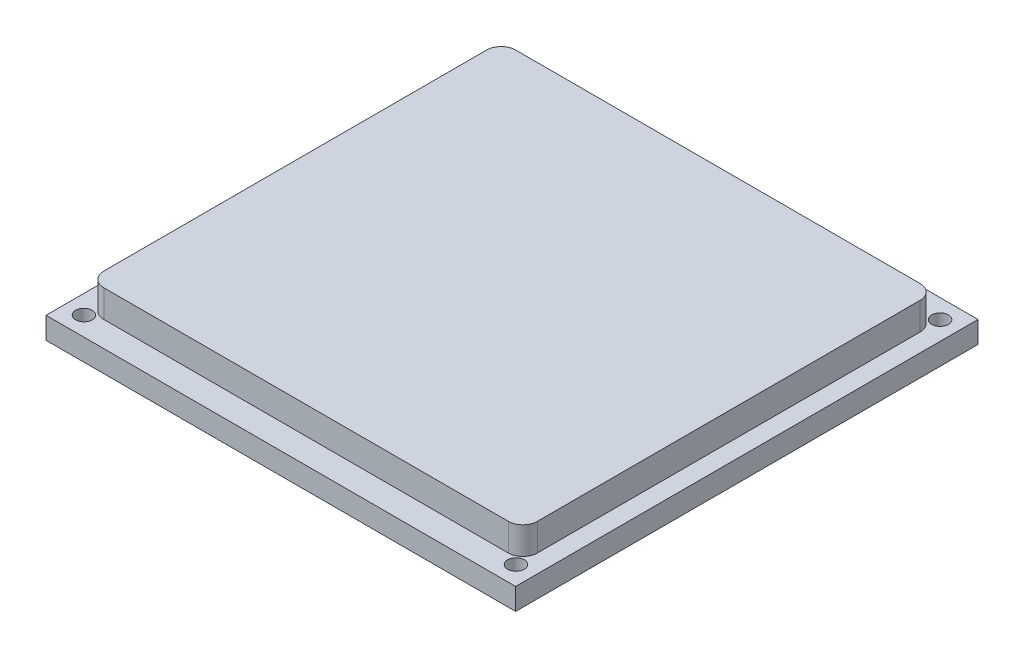
ISO-10303-21;
HEADER;
FILE_DESCRIPTION(('STEP AP214'),'2;1');
FILE_NAME('part.step','',(''),(''),'','','');
FILE_SCHEMA(('AUTOMOTIVE_DESIGN { 1 0 10303 214 1 1 1 1 }'));
ENDSEC;
DATA;
#1=APPLICATION_CONTEXT('core data for automotive mechanical design processes');
#2=APPLICATION_PROTOCOL_DEFINITION('international standard','automotive_design',2000,#1);
#3=PRODUCT_CONTEXT('',#1,'mechanical');
#4=PRODUCT('Part','Part','',(#3));
#5=PRODUCT_RELATED_PRODUCT_CATEGORY('part','',(#4));
#6=PRODUCT_DEFINITION_FORMATION('','',#4);
#7=PRODUCT_DEFINITION_CONTEXT('part definition',#1,'design');
#8=PRODUCT_DEFINITION('design','',#6,#7);
#9=PRODUCT_DEFINITION_SHAPE('','',#8);
#10=(LENGTH_UNIT() NAMED_UNIT(*) SI_UNIT(.MILLI.,.METRE.));
#11=(NAMED_UNIT(*) PLANE_ANGLE_UNIT() SI_UNIT($,.RADIAN.));
#12=(NAMED_UNIT(*) SI_UNIT($,.STERADIAN.) SOLID_ANGLE_UNIT());
#13=UNCERTAINTY_MEASURE_WITH_UNIT(LENGTH_MEASURE(1.E-05),#10,'distance_accuracy_value','');
#14=(GEOMETRIC_REPRESENTATION_CONTEXT(3) GLOBAL_UNCERTAINTY_ASSIGNED_CONTEXT((#13)) GLOBAL_UNIT_ASSIGNED_CONTEXT((#10,
#11,#12)) REPRESENTATION_CONTEXT('',''));
#15=CARTESIAN_POINT('',(0.,0.,0.));
#16=DIRECTION('',(0.,0.,1.));
#17=DIRECTION('',(1.,0.,0.));
#18=AXIS2_PLACEMENT_3D('',#15,#16,#17);
#19=CARTESIAN_POINT('',(0.,3.,0.));
#20=DIRECTION('',(0.,1.,0.));
#21=DIRECTION('',(0.,0.,1.));
#22=AXIS2_PLACEMENT_3D('',#19,#20,#21);
#23=PLANE('',#22);
#24=CARTESIAN_POINT('',(-32.2349514563107,3.,43.6800970873786));
#25=DIRECTION('',(0.,1.,0.));
#26=DIRECTION('',(0.,0.,1.));
#27=AXIS2_PLACEMENT_3D('',#24,#25,#26);
#28=CIRCLE('',#27,1.15);
#29=CARTESIAN_POINT('',(-32.2349514563107,3.,44.8300970873786));
#30=VERTEX_POINT('',#29);
#31=EDGE_CURVE('E167',#30,#30,#28,.T.);
#32=ORIENTED_EDGE('',*,*,#31,.F.);
#33=EDGE_LOOP('',(#32));
#34=FACE_BOUND('',#33,.T.);
#35=CARTESIAN_POINT('',(-32.2349514563107,3.,-15.0199029126214));
#36=DIRECTION('',(0.,1.,0.));
#37=DIRECTION('',(0.,0.,1.));
#38=AXIS2_PLACEMENT_3D('',#35,#36,#37);
#39=CIRCLE('',#38,1.15);
#40=CARTESIAN_POINT('',(-32.2349514563107,3.,-13.8699029126214));
#41=VERTEX_POINT('',#40);
#42=EDGE_CURVE('E179',#41,#41,#39,.T.);
#43=ORIENTED_EDGE('',*,*,#42,.F.);
#44=EDGE_LOOP('',(#43));
#45=FACE_BOUND('',#44,.T.);
#46=DIRECTION('',(0.,0.,1.));
#47=VECTOR('',#46,1.);
#48=CARTESIAN_POINT('',(-34.8349514563107,3.,-17.6699029126214));
#49=LINE('',#48,#47);
#50=CARTESIAN_POINT('',(-34.8349514563107,3.,-17.6699029126214));
#51=VERTEX_POINT('',#50);
#52=CARTESIAN_POINT('',(-34.8349514563107,3.,46.3300970873786));
#53=VERTEX_POINT('',#52);
#54=EDGE_CURVE('E185',#51,#53,#49,.T.);
#55=ORIENTED_EDGE('',*,*,#54,.T.);
#56=DIRECTION('',(1.,0.,0.));
#57=VECTOR('',#56,1.);
#58=CARTESIAN_POINT('',(-34.8349514563107,3.,46.3300970873786));
#59=LINE('',#58,#57);
#60=CARTESIAN_POINT('',(30.1650485436893,3.,46.3300970873786));
#61=VERTEX_POINT('',#60);
#62=EDGE_CURVE('E84',#53,#61,#59,.T.);
#63=ORIENTED_EDGE('',*,*,#62,.T.);
#64=DIRECTION('',(0.,0.,-1.));
#65=VECTOR('',#64,1.);
#66=CARTESIAN_POINT('',(30.1650485436893,3.,-17.6699029126214));
#67=LINE('',#66,#65);
#68=CARTESIAN_POINT('',(30.1650485436893,3.,-17.6699029126214));
#69=VERTEX_POINT('',#68);
#70=EDGE_CURVE('E188',#61,#69,#67,.T.);
#71=ORIENTED_EDGE('',*,*,#70,.T.);
#72=DIRECTION('',(-1.,0.,0.));
#73=VECTOR('',#72,1.);
#74=CARTESIAN_POINT('',(-34.8349514563107,3.,-17.6699029126214));
#75=LINE('',#74,#73);
#76=EDGE_CURVE('E56',#69,#51,#75,.T.);
#77=ORIENTED_EDGE('',*,*,#76,.T.);
#78=EDGE_LOOP('',(#55,#63,#71,#77));
#79=FACE_BOUND('',#78,.T.);
#80=CARTESIAN_POINT('',(27.5650485436893,3.,-15.0199029126214));
#81=DIRECTION('',(0.,1.,0.));
#82=DIRECTION('',(0.,0.,1.));
#83=AXIS2_PLACEMENT_3D('',#80,#81,#82);
#84=CIRCLE('',#83,1.15);
#85=CARTESIAN_POINT('',(27.5650485436893,3.,-13.8699029126214));
#86=VERTEX_POINT('',#85);
#87=EDGE_CURVE('E173',#86,#86,#84,.T.);
#88=ORIENTED_EDGE('',*,*,#87,.F.);
#89=EDGE_LOOP('',(#88));
#90=FACE_BOUND('',#89,.T.);
#91=CARTESIAN_POINT('',(27.5650485436893,3.,43.6800970873786));
#92=DIRECTION('',(0.,1.,0.));
#93=DIRECTION('',(0.,0.,1.));
#94=AXIS2_PLACEMENT_3D('',#91,#92,#93);
#95=CIRCLE('',#94,1.15);
#96=CARTESIAN_POINT('',(27.5650485436893,3.,44.8300970873786));
#97=VERTEX_POINT('',#96);
#98=EDGE_CURVE('E158',#97,#97,#95,.T.);
#99=ORIENTED_EDGE('',*,*,#98,.F.);
#100=EDGE_LOOP('',(#99));
#101=FACE_BOUND('',#100,.T.);
#102=DIRECTION('',(0.,0.,1.));
#103=VECTOR('',#102,1.);
#104=CARTESIAN_POINT('',(-32.3349514563107,3.,-12.1699029126214));
#105=LINE('',#104,#103);
#106=CARTESIAN_POINT('',(-32.3349514563107,3.,-12.1699029126214));
#107=VERTEX_POINT('',#106);
#108=CARTESIAN_POINT('',(-32.3349514563107,3.,40.8300970873786));
#109=VERTEX_POINT('',#108);
#110=EDGE_CURVE('E396',#107,#109,#105,.T.);
#111=ORIENTED_EDGE('',*,*,#110,.F.);
#112=CARTESIAN_POINT('',(-30.3349514563107,3.,-12.1699029126214));
#113=DIRECTION('',(0.,1.,0.));
#114=DIRECTION('',(0.,0.,1.));
#115=AXIS2_PLACEMENT_3D('',#112,#113,#114);
#116=CIRCLE('',#115,2.);
#117=CARTESIAN_POINT('',(-30.3349514563107,3.,-14.1699029126214));
#118=VERTEX_POINT('',#117);
#119=EDGE_CURVE('E153',#118,#107,#116,.T.);
#120=ORIENTED_EDGE('',*,*,#119,.F.);
#121=DIRECTION('',(-1.,0.,0.));
#122=VECTOR('',#121,1.);
#123=CARTESIAN_POINT('',(-30.3349514563107,3.,-14.1699029126214));
#124=LINE('',#123,#122);
#125=CARTESIAN_POINT('',(25.6650485436893,3.,-14.1699029126214));
#126=VERTEX_POINT('',#125);
#127=EDGE_CURVE('E149',#126,#118,#124,.T.);
#128=ORIENTED_EDGE('',*,*,#127,.F.);
#129=CARTESIAN_POINT('',(25.6650485436893,3.,-12.1699029126214));
#130=DIRECTION('',(0.,1.,0.));
#131=DIRECTION('',(0.,0.,1.));
#132=AXIS2_PLACEMENT_3D('',#129,#130,#131);
#133=CIRCLE('',#132,2.00000000000001);
#134=CARTESIAN_POINT('',(27.6650485436893,3.,-12.1699029126214));
#135=VERTEX_POINT('',#134);
#136=EDGE_CURVE('E392',#135,#126,#133,.T.);
#137=ORIENTED_EDGE('',*,*,#136,.F.);
#138=DIRECTION('',(0.,0.,-1.));
#139=VECTOR('',#138,1.);
#140=CARTESIAN_POINT('',(27.6650485436893,3.,-12.1699029126214));
#141=LINE('',#140,#139);
#142=CARTESIAN_POINT('',(27.6650485436893,3.,40.8300970873786));
#143=VERTEX_POINT('',#142);
#144=EDGE_CURVE('E408',#143,#135,#141,.T.);
#145=ORIENTED_EDGE('',*,*,#144,.F.);
#146=CARTESIAN_POINT('',(25.6650485436893,3.,40.8300970873786));
#147=DIRECTION('',(0.,1.,0.));
#148=DIRECTION('',(0.,0.,1.));
#149=AXIS2_PLACEMENT_3D('',#146,#147,#148);
#150=CIRCLE('',#149,2.);
#151=CARTESIAN_POINT('',(25.6650485436893,3.,42.8300970873786));
#152=VERTEX_POINT('',#151);
#153=EDGE_CURVE('E406',#152,#143,#150,.T.);
#154=ORIENTED_EDGE('',*,*,#153,.F.);
#155=DIRECTION('',(1.,0.,0.));
#156=VECTOR('',#155,1.);
#157=CARTESIAN_POINT('',(-30.3349514563107,3.,42.8300970873786));
#158=LINE('',#157,#156);
#159=CARTESIAN_POINT('',(-30.3349514563107,3.,42.8300970873786));
#160=VERTEX_POINT('',#159);
#161=EDGE_CURVE('E404',#160,#152,#158,.T.);
#162=ORIENTED_EDGE('',*,*,#161,.F.);
#163=CARTESIAN_POINT('',(-30.3349514563107,3.,40.8300970873786));
#164=DIRECTION('',(0.,1.,0.));
#165=DIRECTION('',(0.,0.,1.));
#166=AXIS2_PLACEMENT_3D('',#163,#164,#165);
#167=CIRCLE('',#166,2.);
#168=EDGE_CURVE('E398',#109,#160,#167,.T.);
#169=ORIENTED_EDGE('',*,*,#168,.F.);
#170=EDGE_LOOP('',(#111,#120,#128,#137,#145,#154,#162,#169));
#171=FACE_BOUND('',#170,.T.);
#172=ADVANCED_FACE('F32',(#34,#45,#79,#90,#101,#171),#23,.T.);
#173=CARTESIAN_POINT('',(0.,0.,0.));
#174=DIRECTION('',(0.,1.,0.));
#175=DIRECTION('',(0.,0.,1.));
#176=AXIS2_PLACEMENT_3D('',#173,#174,#175);
#177=PLANE('',#176);
#178=DIRECTION('',(0.,0.,1.));
#179=VECTOR('',#178,1.);
#180=CARTESIAN_POINT('',(-34.8349514563107,0.,-17.6699029126214));
#181=LINE('',#180,#179);
#182=CARTESIAN_POINT('',(-34.8349514563107,0.,-17.6699029126214));
#183=VERTEX_POINT('',#182);
#184=CARTESIAN_POINT('',(-34.8349514563107,0.,46.3300970873786));
#185=VERTEX_POINT('',#184);
#186=EDGE_CURVE('E182',#183,#185,#181,.T.);
#187=ORIENTED_EDGE('',*,*,#186,.F.);
#188=DIRECTION('',(-1.,0.,0.));
#189=VECTOR('',#188,1.);
#190=CARTESIAN_POINT('',(-34.8349514563107,0.,-17.6699029126214));
#191=LINE('',#190,#189);
#192=CARTESIAN_POINT('',(30.1650485436893,0.,-17.6699029126214));
#193=VERTEX_POINT('',#192);
#194=EDGE_CURVE('E77',#193,#183,#191,.T.);
#195=ORIENTED_EDGE('',*,*,#194,.F.);
#196=DIRECTION('',(0.,0.,-1.));
#197=VECTOR('',#196,1.);
#198=CARTESIAN_POINT('',(30.1650485436893,0.,-17.6699029126214));
#199=LINE('',#198,#197);
#200=CARTESIAN_POINT('',(30.1650485436893,0.,46.3300970873786));
#201=VERTEX_POINT('',#200);
#202=EDGE_CURVE('E196',#201,#193,#199,.T.);
#203=ORIENTED_EDGE('',*,*,#202,.F.);
#204=DIRECTION('',(1.,0.,0.));
#205=VECTOR('',#204,1.);
#206=CARTESIAN_POINT('',(-34.8349514563107,0.,46.3300970873786));
#207=LINE('',#206,#205);
#208=EDGE_CURVE('E194',#185,#201,#207,.T.);
#209=ORIENTED_EDGE('',*,*,#208,.F.);
#210=EDGE_LOOP('',(#187,#195,#203,#209));
#211=FACE_BOUND('',#210,.T.);
#212=CARTESIAN_POINT('',(-32.2349514563107,0.,-15.0199029126214));
#213=DIRECTION('',(0.,1.,0.));
#214=DIRECTION('',(0.,0.,1.));
#215=AXIS2_PLACEMENT_3D('',#212,#213,#214);
#216=CIRCLE('',#215,1.15);
#217=CARTESIAN_POINT('',(-32.2349514563107,0.,-13.8699029126214));
#218=VERTEX_POINT('',#217);
#219=EDGE_CURVE('E176',#218,#218,#216,.T.);
#220=ORIENTED_EDGE('',*,*,#219,.T.);
#221=EDGE_LOOP('',(#220));
#222=FACE_BOUND('',#221,.T.);
#223=CARTESIAN_POINT('',(27.5650485436893,0.,-15.0199029126214));
#224=DIRECTION('',(0.,1.,0.));
#225=DIRECTION('',(0.,0.,1.));
#226=AXIS2_PLACEMENT_3D('',#223,#224,#225);
#227=CIRCLE('',#226,1.15);
#228=CARTESIAN_POINT('',(27.5650485436893,0.,-13.8699029126214));
#229=VERTEX_POINT('',#228);
#230=EDGE_CURVE('E170',#229,#229,#227,.T.);
#231=ORIENTED_EDGE('',*,*,#230,.T.);
#232=EDGE_LOOP('',(#231));
#233=FACE_BOUND('',#232,.T.);
#234=CARTESIAN_POINT('',(-32.2349514563107,0.,43.6800970873786));
#235=DIRECTION('',(0.,1.,0.));
#236=DIRECTION('',(0.,0.,1.));
#237=AXIS2_PLACEMENT_3D('',#234,#235,#236);
#238=CIRCLE('',#237,1.15);
#239=CARTESIAN_POINT('',(-32.2349514563107,0.,44.8300970873786));
#240=VERTEX_POINT('',#239);
#241=EDGE_CURVE('E165',#240,#240,#238,.T.);
#242=ORIENTED_EDGE('',*,*,#241,.T.);
#243=EDGE_LOOP('',(#242));
#244=FACE_BOUND('',#243,.T.);
#245=CARTESIAN_POINT('',(27.5650485436893,0.,43.6800970873786));
#246=DIRECTION('',(0.,1.,0.));
#247=DIRECTION('',(0.,0.,1.));
#248=AXIS2_PLACEMENT_3D('',#245,#246,#247);
#249=CIRCLE('',#248,1.15);
#250=CARTESIAN_POINT('',(27.5650485436893,0.,44.8300970873786));
#251=VERTEX_POINT('',#250);
#252=EDGE_CURVE('E155',#251,#251,#249,.T.);
#253=ORIENTED_EDGE('',*,*,#252,.T.);
#254=EDGE_LOOP('',(#253));
#255=FACE_BOUND('',#254,.T.);
#256=ADVANCED_FACE('F209',(#211,#222,#233,#244,#255),#177,.F.);
#257=CARTESIAN_POINT('',(-34.8349514563107,3.,-17.6699029126214));
#258=DIRECTION('',(1.,0.,0.));
#259=DIRECTION('',(0.,0.,-1.));
#260=AXIS2_PLACEMENT_3D('',#257,#258,#259);
#261=PLANE('',#260);
#262=ORIENTED_EDGE('',*,*,#186,.T.);
#263=DIRECTION('',(0.,-1.,0.));
#264=VECTOR('',#263,1.);
#265=CARTESIAN_POINT('',(-34.8349514563107,3.,46.3300970873786));
#266=LINE('',#265,#264);
#267=EDGE_CURVE('E11',#53,#185,#266,.T.);
#268=ORIENTED_EDGE('',*,*,#267,.F.);
#269=ORIENTED_EDGE('',*,*,#54,.F.);
#270=DIRECTION('',(0.,-1.,0.));
#271=VECTOR('',#270,1.);
#272=CARTESIAN_POINT('',(-34.8349514563107,3.,-17.6699029126214));
#273=LINE('',#272,#271);
#274=EDGE_CURVE('E191',#51,#183,#273,.T.);
#275=ORIENTED_EDGE('',*,*,#274,.T.);
#276=EDGE_LOOP('',(#262,#268,#269,#275));
#277=FACE_BOUND('',#276,.T.);
#278=ADVANCED_FACE('F34',(#277),#261,.F.);
#279=CARTESIAN_POINT('',(-34.8349514563107,3.,46.3300970873786));
#280=DIRECTION('',(0.,0.,-1.));
#281=DIRECTION('',(-1.,0.,0.));
#282=AXIS2_PLACEMENT_3D('',#279,#280,#281);
#283=PLANE('',#282);
#284=ORIENTED_EDGE('',*,*,#208,.T.);
#285=DIRECTION('',(0.,-1.,0.));
#286=VECTOR('',#285,1.);
#287=CARTESIAN_POINT('',(30.1650485436893,3.,46.3300970873786));
#288=LINE('',#287,#286);
#289=EDGE_CURVE('E40',#61,#201,#288,.T.);
#290=ORIENTED_EDGE('',*,*,#289,.F.);
#291=ORIENTED_EDGE('',*,*,#62,.F.);
#292=ORIENTED_EDGE('',*,*,#267,.T.);
#293=EDGE_LOOP('',(#284,#290,#291,#292));
#294=FACE_BOUND('',#293,.T.);
#295=ADVANCED_FACE('F225',(#294),#283,.F.);
#296=CARTESIAN_POINT('',(30.1650485436893,3.,-17.6699029126214));
#297=DIRECTION('',(-1.,0.,0.));
#298=DIRECTION('',(0.,0.,1.));
#299=AXIS2_PLACEMENT_3D('',#296,#297,#298);
#300=PLANE('',#299);
#301=ORIENTED_EDGE('',*,*,#202,.T.);
#302=DIRECTION('',(0.,-1.,0.));
#303=VECTOR('',#302,1.);
#304=CARTESIAN_POINT('',(30.1650485436893,3.,-17.6699029126214));
#305=LINE('',#304,#303);
#306=EDGE_CURVE('E200',#69,#193,#305,.T.);
#307=ORIENTED_EDGE('',*,*,#306,.F.);
#308=ORIENTED_EDGE('',*,*,#70,.F.);
#309=ORIENTED_EDGE('',*,*,#289,.T.);
#310=EDGE_LOOP('',(#301,#307,#308,#309));
#311=FACE_BOUND('',#310,.T.);
#312=ADVANCED_FACE('F205',(#311),#300,.F.);
#313=CARTESIAN_POINT('',(-34.8349514563107,3.,-17.6699029126214));
#314=DIRECTION('',(0.,0.,1.));
#315=DIRECTION('',(1.,0.,0.));
#316=AXIS2_PLACEMENT_3D('',#313,#314,#315);
#317=PLANE('',#316);
#318=ORIENTED_EDGE('',*,*,#194,.T.);
#319=ORIENTED_EDGE('',*,*,#274,.F.);
#320=ORIENTED_EDGE('',*,*,#76,.F.);
#321=ORIENTED_EDGE('',*,*,#306,.T.);
#322=EDGE_LOOP('',(#318,#319,#320,#321));
#323=FACE_BOUND('',#322,.T.);
#324=ADVANCED_FACE('F214',(#323),#317,.F.);
#325=CARTESIAN_POINT('',(-32.2349514563107,3.,-15.0199029126214));
#326=DIRECTION('',(0.,-1.,0.));
#327=DIRECTION('',(0.,0.,-1.));
#328=AXIS2_PLACEMENT_3D('',#325,#326,#327);
#329=CYLINDRICAL_SURFACE('',#328,1.15);
#330=ORIENTED_EDGE('',*,*,#42,.T.);
#331=EDGE_LOOP('',(#330));
#332=FACE_BOUND('',#331,.T.);
#333=ORIENTED_EDGE('',*,*,#219,.F.);
#334=EDGE_LOOP('',(#333));
#335=FACE_BOUND('',#334,.T.);
#336=ADVANCED_FACE('F216',(#332,#335),#329,.F.);
#337=CARTESIAN_POINT('',(27.5650485436893,3.,-15.0199029126214));
#338=DIRECTION('',(0.,-1.,0.));
#339=DIRECTION('',(0.,0.,-1.));
#340=AXIS2_PLACEMENT_3D('',#337,#338,#339);
#341=CYLINDRICAL_SURFACE('',#340,1.15);
#342=ORIENTED_EDGE('',*,*,#87,.T.);
#343=EDGE_LOOP('',(#342));
#344=FACE_BOUND('',#343,.T.);
#345=ORIENTED_EDGE('',*,*,#230,.F.);
#346=EDGE_LOOP('',(#345));
#347=FACE_BOUND('',#346,.T.);
#348=ADVANCED_FACE('F222',(#344,#347),#341,.F.);
#349=CARTESIAN_POINT('',(-32.2349514563107,3.,43.6800970873786));
#350=DIRECTION('',(0.,-1.,0.));
#351=DIRECTION('',(0.,0.,-1.));
#352=AXIS2_PLACEMENT_3D('',#349,#350,#351);
#353=CYLINDRICAL_SURFACE('',#352,1.15);
#354=ORIENTED_EDGE('',*,*,#31,.T.);
#355=EDGE_LOOP('',(#354));
#356=FACE_BOUND('',#355,.T.);
#357=ORIENTED_EDGE('',*,*,#241,.F.);
#358=EDGE_LOOP('',(#357));
#359=FACE_BOUND('',#358,.T.);
#360=ADVANCED_FACE('F239',(#356,#359),#353,.F.);
#361=CARTESIAN_POINT('',(27.5650485436893,3.,43.6800970873786));
#362=DIRECTION('',(0.,-1.,0.));
#363=DIRECTION('',(0.,0.,-1.));
#364=AXIS2_PLACEMENT_3D('',#361,#362,#363);
#365=CYLINDRICAL_SURFACE('',#364,1.15);
#366=ORIENTED_EDGE('',*,*,#98,.T.);
#367=EDGE_LOOP('',(#366));
#368=FACE_BOUND('',#367,.T.);
#369=ORIENTED_EDGE('',*,*,#252,.F.);
#370=EDGE_LOOP('',(#369));
#371=FACE_BOUND('',#370,.T.);
#372=ADVANCED_FACE('F243',(#368,#371),#365,.F.);
#373=CARTESIAN_POINT('',(-30.3349514563107,6.8,-12.1699029126214));
#374=DIRECTION('',(0.,-1.,0.));
#375=DIRECTION('',(0.,0.,-1.));
#376=AXIS2_PLACEMENT_3D('',#373,#374,#375);
#377=CYLINDRICAL_SURFACE('',#376,2.);
#378=ORIENTED_EDGE('',*,*,#119,.T.);
#379=DIRECTION('',(0.,-1.,0.));
#380=VECTOR('',#379,1.);
#381=CARTESIAN_POINT('',(-32.3349514563107,6.8,-12.1699029126214));
#382=LINE('',#381,#380);
#383=CARTESIAN_POINT('',(-32.3349514563107,6.8,-12.1699029126214));
#384=VERTEX_POINT('',#383);
#385=EDGE_CURVE('E134',#384,#107,#382,.T.);
#386=ORIENTED_EDGE('',*,*,#385,.F.);
#387=CARTESIAN_POINT('',(-30.3349514563107,6.8,-12.1699029126214));
#388=DIRECTION('',(0.,1.,0.));
#389=DIRECTION('',(0.,0.,1.));
#390=AXIS2_PLACEMENT_3D('',#387,#388,#389);
#391=CIRCLE('',#390,2.);
#392=CARTESIAN_POINT('',(-30.3349514563107,6.8,-14.1699029126214));
#393=VERTEX_POINT('',#392);
#394=EDGE_CURVE('E141',#393,#384,#391,.T.);
#395=ORIENTED_EDGE('',*,*,#394,.F.);
#396=DIRECTION('',(0.,-1.,0.));
#397=VECTOR('',#396,1.);
#398=CARTESIAN_POINT('',(-30.3349514563107,6.8,-14.1699029126214));
#399=LINE('',#398,#397);
#400=EDGE_CURVE('E389',#393,#118,#399,.T.);
#401=ORIENTED_EDGE('',*,*,#400,.T.);
#402=EDGE_LOOP('',(#378,#386,#395,#401));
#403=FACE_BOUND('',#402,.T.);
#404=ADVANCED_FACE('F151',(#403),#377,.T.);
#405=CARTESIAN_POINT('',(-32.3349514563107,6.8,-12.1699029126214));
#406=DIRECTION('',(1.,0.,0.));
#407=DIRECTION('',(0.,0.,-1.));
#408=AXIS2_PLACEMENT_3D('',#405,#406,#407);
#409=PLANE('',#408);
#410=ORIENTED_EDGE('',*,*,#110,.T.);
#411=DIRECTION('',(0.,-1.,0.));
#412=VECTOR('',#411,1.);
#413=CARTESIAN_POINT('',(-32.3349514563107,6.8,40.8300970873786));
#414=LINE('',#413,#412);
#415=CARTESIAN_POINT('',(-32.3349514563107,6.8,40.8300970873786));
#416=VERTEX_POINT('',#415);
#417=EDGE_CURVE('E137',#416,#109,#414,.T.);
#418=ORIENTED_EDGE('',*,*,#417,.F.);
#419=DIRECTION('',(0.,0.,1.));
#420=VECTOR('',#419,1.);
#421=CARTESIAN_POINT('',(-32.3349514563107,6.8,-12.1699029126214));
#422=LINE('',#421,#420);
#423=EDGE_CURVE('E130',#384,#416,#422,.T.);
#424=ORIENTED_EDGE('',*,*,#423,.F.);
#425=ORIENTED_EDGE('',*,*,#385,.T.);
#426=EDGE_LOOP('',(#410,#418,#424,#425));
#427=FACE_BOUND('',#426,.T.);
#428=ADVANCED_FACE('F132',(#427),#409,.F.);
#429=CARTESIAN_POINT('',(-30.3349514563107,6.8,40.8300970873786));
#430=DIRECTION('',(0.,-1.,0.));
#431=DIRECTION('',(0.,0.,-1.));
#432=AXIS2_PLACEMENT_3D('',#429,#430,#431);
#433=CYLINDRICAL_SURFACE('',#432,2.);
#434=ORIENTED_EDGE('',*,*,#168,.T.);
#435=DIRECTION('',(0.,-1.,0.));
#436=VECTOR('',#435,1.);
#437=CARTESIAN_POINT('',(-30.3349514563107,6.8,42.8300970873786));
#438=LINE('',#437,#436);
#439=CARTESIAN_POINT('',(-30.3349514563107,6.8,42.8300970873786));
#440=VERTEX_POINT('',#439);
#441=EDGE_CURVE('E160',#440,#160,#438,.T.);
#442=ORIENTED_EDGE('',*,*,#441,.F.);
#443=CARTESIAN_POINT('',(-30.3349514563107,6.8,40.8300970873786));
#444=DIRECTION('',(0.,1.,0.));
#445=DIRECTION('',(0.,0.,1.));
#446=AXIS2_PLACEMENT_3D('',#443,#444,#445);
#447=CIRCLE('',#446,2.);
#448=EDGE_CURVE('E140',#416,#440,#447,.T.);
#449=ORIENTED_EDGE('',*,*,#448,.F.);
#450=ORIENTED_EDGE('',*,*,#417,.T.);
#451=EDGE_LOOP('',(#434,#442,#449,#450));
#452=FACE_BOUND('',#451,.T.);
#453=ADVANCED_FACE('F252',(#452),#433,.T.);
#454=CARTESIAN_POINT('',(-30.3349514563107,6.8,42.8300970873786));
#455=DIRECTION('',(0.,0.,-1.));
#456=DIRECTION('',(-1.,0.,0.));
#457=AXIS2_PLACEMENT_3D('',#454,#455,#456);
#458=PLANE('',#457);
#459=ORIENTED_EDGE('',*,*,#161,.T.);
#460=DIRECTION('',(0.,-1.,0.));
#461=VECTOR('',#460,1.);
#462=CARTESIAN_POINT('',(25.6650485436893,6.8,42.8300970873786));
#463=LINE('',#462,#461);
#464=CARTESIAN_POINT('',(25.6650485436893,6.8,42.8300970873786));
#465=VERTEX_POINT('',#464);
#466=EDGE_CURVE('E418',#465,#152,#463,.T.);
#467=ORIENTED_EDGE('',*,*,#466,.F.);
#468=DIRECTION('',(1.,0.,0.));
#469=VECTOR('',#468,1.);
#470=CARTESIAN_POINT('',(-30.3349514563107,6.8,42.8300970873786));
#471=LINE('',#470,#469);
#472=EDGE_CURVE('E425',#440,#465,#471,.T.);
#473=ORIENTED_EDGE('',*,*,#472,.F.);
#474=ORIENTED_EDGE('',*,*,#441,.T.);
#475=EDGE_LOOP('',(#459,#467,#473,#474));
#476=FACE_BOUND('',#475,.T.);
#477=ADVANCED_FACE('F255',(#476),#458,.F.);
#478=CARTESIAN_POINT('',(25.6650485436893,6.8,40.8300970873786));
#479=DIRECTION('',(0.,-1.,0.));
#480=DIRECTION('',(0.,0.,-1.));
#481=AXIS2_PLACEMENT_3D('',#478,#479,#480);
#482=CYLINDRICAL_SURFACE('',#481,2.);
#483=ORIENTED_EDGE('',*,*,#153,.T.);
#484=DIRECTION('',(0.,-1.,0.));
#485=VECTOR('',#484,1.);
#486=CARTESIAN_POINT('',(27.6650485436893,6.8,40.8300970873786));
#487=LINE('',#486,#485);
#488=CARTESIAN_POINT('',(27.6650485436893,6.8,40.8300970873786));
#489=VERTEX_POINT('',#488);
#490=EDGE_CURVE('E415',#489,#143,#487,.T.);
#491=ORIENTED_EDGE('',*,*,#490,.F.);
#492=CARTESIAN_POINT('',(25.6650485436893,6.8,40.8300970873786));
#493=DIRECTION('',(0.,1.,0.));
#494=DIRECTION('',(0.,0.,1.));
#495=AXIS2_PLACEMENT_3D('',#492,#493,#494);
#496=CIRCLE('',#495,2.);
#497=EDGE_CURVE('E435',#465,#489,#496,.T.);
#498=ORIENTED_EDGE('',*,*,#497,.F.);
#499=ORIENTED_EDGE('',*,*,#466,.T.);
#500=EDGE_LOOP('',(#483,#491,#498,#499));
#501=FACE_BOUND('',#500,.T.);
#502=ADVANCED_FACE('F259',(#501),#482,.T.);
#503=CARTESIAN_POINT('',(27.6650485436893,6.8,-12.1699029126214));
#504=DIRECTION('',(-1.,0.,0.));
#505=DIRECTION('',(0.,0.,1.));
#506=AXIS2_PLACEMENT_3D('',#503,#504,#505);
#507=PLANE('',#506);
#508=ORIENTED_EDGE('',*,*,#144,.T.);
#509=DIRECTION('',(0.,-1.,0.));
#510=VECTOR('',#509,1.);
#511=CARTESIAN_POINT('',(27.6650485436893,6.8,-12.1699029126214));
#512=LINE('',#511,#510);
#513=CARTESIAN_POINT('',(27.6650485436893,6.8,-12.1699029126214));
#514=VERTEX_POINT('',#513);
#515=EDGE_CURVE('E412',#514,#135,#512,.T.);
#516=ORIENTED_EDGE('',*,*,#515,.F.);
#517=DIRECTION('',(0.,0.,-1.));
#518=VECTOR('',#517,1.);
#519=CARTESIAN_POINT('',(27.6650485436893,6.8,-12.1699029126214));
#520=LINE('',#519,#518);
#521=EDGE_CURVE('E432',#489,#514,#520,.T.);
#522=ORIENTED_EDGE('',*,*,#521,.F.);
#523=ORIENTED_EDGE('',*,*,#490,.T.);
#524=EDGE_LOOP('',(#508,#516,#522,#523));
#525=FACE_BOUND('',#524,.T.);
#526=ADVANCED_FACE('F263',(#525),#507,.F.);
#527=CARTESIAN_POINT('',(25.6650485436893,6.8,-12.1699029126214));
#528=DIRECTION('',(0.,-1.,0.));
#529=DIRECTION('',(0.,0.,-1.));
#530=AXIS2_PLACEMENT_3D('',#527,#528,#529);
#531=CYLINDRICAL_SURFACE('',#530,2.00000000000001);
#532=ORIENTED_EDGE('',*,*,#136,.T.);
#533=DIRECTION('',(0.,-1.,0.));
#534=VECTOR('',#533,1.);
#535=CARTESIAN_POINT('',(25.6650485436893,6.8,-14.1699029126214));
#536=LINE('',#535,#534);
#537=CARTESIAN_POINT('',(25.6650485436893,6.8,-14.1699029126214));
#538=VERTEX_POINT('',#537);
#539=EDGE_CURVE('E47',#538,#126,#536,.T.);
#540=ORIENTED_EDGE('',*,*,#539,.F.);
#541=CARTESIAN_POINT('',(25.6650485436893,6.8,-12.1699029126214));
#542=DIRECTION('',(0.,1.,0.));
#543=DIRECTION('',(0.,0.,1.));
#544=AXIS2_PLACEMENT_3D('',#541,#542,#543);
#545=CIRCLE('',#544,2.00000000000001);
#546=EDGE_CURVE('E434',#514,#538,#545,.T.);
#547=ORIENTED_EDGE('',*,*,#546,.F.);
#548=ORIENTED_EDGE('',*,*,#515,.T.);
#549=EDGE_LOOP('',(#532,#540,#547,#548));
#550=FACE_BOUND('',#549,.T.);
#551=ADVANCED_FACE('F267',(#550),#531,.T.);
#552=CARTESIAN_POINT('',(-30.3349514563107,6.8,-14.1699029126214));
#553=DIRECTION('',(0.,0.,1.));
#554=DIRECTION('',(1.,0.,0.));
#555=AXIS2_PLACEMENT_3D('',#552,#553,#554);
#556=PLANE('',#555);
#557=ORIENTED_EDGE('',*,*,#127,.T.);
#558=ORIENTED_EDGE('',*,*,#400,.F.);
#559=DIRECTION('',(-1.,0.,0.));
#560=VECTOR('',#559,1.);
#561=CARTESIAN_POINT('',(-30.3349514563107,6.8,-14.1699029126214));
#562=LINE('',#561,#560);
#563=EDGE_CURVE('E145',#538,#393,#562,.T.);
#564=ORIENTED_EDGE('',*,*,#563,.F.);
#565=ORIENTED_EDGE('',*,*,#539,.T.);
#566=EDGE_LOOP('',(#557,#558,#564,#565));
#567=FACE_BOUND('',#566,.T.);
#568=ADVANCED_FACE('F271',(#567),#556,.F.);
#569=CARTESIAN_POINT('',(-30.3349514563107,6.8,-12.1699029126214));
#570=DIRECTION('',(0.,1.,0.));
#571=DIRECTION('',(0.,0.,1.));
#572=AXIS2_PLACEMENT_3D('',#569,#570,#571);
#573=PLANE('',#572);
#574=ORIENTED_EDGE('',*,*,#394,.T.);
#575=ORIENTED_EDGE('',*,*,#423,.T.);
#576=ORIENTED_EDGE('',*,*,#448,.T.);
#577=ORIENTED_EDGE('',*,*,#472,.T.);
#578=ORIENTED_EDGE('',*,*,#497,.T.);
#579=ORIENTED_EDGE('',*,*,#521,.T.);
#580=ORIENTED_EDGE('',*,*,#546,.T.);
#581=ORIENTED_EDGE('',*,*,#563,.T.);
#582=EDGE_LOOP('',(#574,#575,#576,#577,#578,#579,#580,#581));
#583=FACE_BOUND('',#582,.T.);
#584=ADVANCED_FACE('F144',(#583),#573,.T.);
#585=CLOSED_SHELL('',(#172,#256,#278,#295,#312,#324,#336,#348,#360,#372,#404,#428,#453,#477,
#502,#526,#551,#568,#584));
#586=MANIFOLD_SOLID_BREP('B2',#585);
#587=ADVANCED_BREP_SHAPE_REPRESENTATION('',(#18,#586),#14);
#588=SHAPE_DEFINITION_REPRESENTATION(#9,#587);
ENDSEC;
END-ISO-10303-21;
